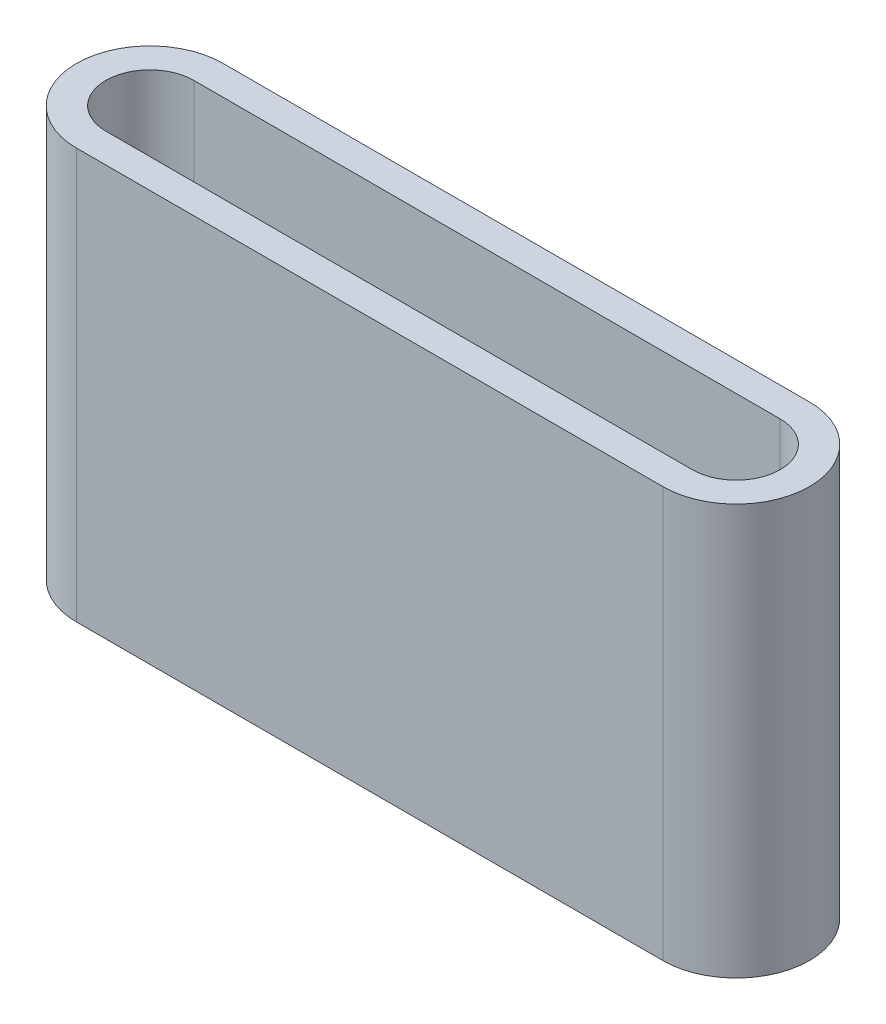
ISO-10303-21;
HEADER;
FILE_DESCRIPTION(('STEP AP214'),'2;1');
FILE_NAME('part.step','',(''),(''),'','','');
FILE_SCHEMA(('AUTOMOTIVE_DESIGN { 1 0 10303 214 1 1 1 1 }'));
ENDSEC;
DATA;
#1=APPLICATION_CONTEXT('core data for automotive mechanical design processes');
#2=APPLICATION_PROTOCOL_DEFINITION('international standard','automotive_design',2000,#1);
#3=PRODUCT_CONTEXT('',#1,'mechanical');
#4=PRODUCT('Part','Part','',(#3));
#5=PRODUCT_RELATED_PRODUCT_CATEGORY('part','',(#4));
#6=PRODUCT_DEFINITION_FORMATION('','',#4);
#7=PRODUCT_DEFINITION_CONTEXT('part definition',#1,'design');
#8=PRODUCT_DEFINITION('design','',#6,#7);
#9=PRODUCT_DEFINITION_SHAPE('','',#8);
#10=(LENGTH_UNIT() NAMED_UNIT(*) SI_UNIT(.MILLI.,.METRE.));
#11=(NAMED_UNIT(*) PLANE_ANGLE_UNIT() SI_UNIT($,.RADIAN.));
#12=(NAMED_UNIT(*) SI_UNIT($,.STERADIAN.) SOLID_ANGLE_UNIT());
#13=UNCERTAINTY_MEASURE_WITH_UNIT(LENGTH_MEASURE(1.E-05),#10,'distance_accuracy_value','');
#14=(GEOMETRIC_REPRESENTATION_CONTEXT(3) GLOBAL_UNCERTAINTY_ASSIGNED_CONTEXT((#13)) GLOBAL_UNIT_ASSIGNED_CONTEXT((#10,
#11,#12)) REPRESENTATION_CONTEXT('',''));
#15=CARTESIAN_POINT('',(0.,0.,0.));
#16=DIRECTION('',(0.,0.,1.));
#17=DIRECTION('',(1.,0.,0.));
#18=AXIS2_PLACEMENT_3D('',#15,#16,#17);
#19=CARTESIAN_POINT('',(0.,-10.,0.));
#20=DIRECTION('',(0.,1.,0.));
#21=DIRECTION('',(0.,0.,1.));
#22=AXIS2_PLACEMENT_3D('',#19,#20,#21);
#23=CYLINDRICAL_SURFACE('',#22,12.5);
#24=DIRECTION('',(0.,1.,0.));
#25=VECTOR('',#24,1.);
#26=CARTESIAN_POINT('',(0.,-10.,12.5));
#27=LINE('',#26,#25);
#28=CARTESIAN_POINT('',(0.,-10.,12.5));
#29=VERTEX_POINT('',#28);
#30=CARTESIAN_POINT('',(0.,60.,12.5));
#31=VERTEX_POINT('',#30);
#32=EDGE_CURVE('E66',#29,#31,#27,.T.);
#33=ORIENTED_EDGE('',*,*,#32,.T.);
#34=CARTESIAN_POINT('',(0.,60.,0.));
#35=DIRECTION('',(0.,1.,0.));
#36=DIRECTION('',(0.,0.,1.));
#37=AXIS2_PLACEMENT_3D('',#34,#35,#36);
#38=CIRCLE('',#37,12.5);
#39=CARTESIAN_POINT('',(0.,60.,-12.5));
#40=VERTEX_POINT('',#39);
#41=EDGE_CURVE('E145',#40,#31,#38,.T.);
#42=ORIENTED_EDGE('',*,*,#41,.F.);
#43=DIRECTION('',(0.,1.,0.));
#44=VECTOR('',#43,1.);
#45=CARTESIAN_POINT('',(0.,-10.,-12.5));
#46=LINE('',#45,#44);
#47=CARTESIAN_POINT('',(0.,-10.,-12.5));
#48=VERTEX_POINT('',#47);
#49=EDGE_CURVE('E12',#48,#40,#46,.T.);
#50=ORIENTED_EDGE('',*,*,#49,.F.);
#51=CARTESIAN_POINT('',(0.,-10.,0.));
#52=DIRECTION('',(0.,1.,0.));
#53=DIRECTION('',(0.,0.,1.));
#54=AXIS2_PLACEMENT_3D('',#51,#52,#53);
#55=CIRCLE('',#54,12.5);
#56=EDGE_CURVE('E192',#48,#29,#55,.T.);
#57=ORIENTED_EDGE('',*,*,#56,.T.);
#58=EDGE_LOOP('',(#33,#42,#50,#57));
#59=FACE_BOUND('',#58,.T.);
#60=ADVANCED_FACE('F63',(#59),#23,.T.);
#61=CARTESIAN_POINT('',(0.,-10.,-12.5));
#62=DIRECTION('',(0.,0.,-1.));
#63=DIRECTION('',(-1.,0.,0.));
#64=AXIS2_PLACEMENT_3D('',#61,#62,#63);
#65=PLANE('',#64);
#66=ORIENTED_EDGE('',*,*,#49,.T.);
#67=DIRECTION('',(-1.,0.,0.));
#68=VECTOR('',#67,1.);
#69=CARTESIAN_POINT('',(100.,60.,-12.5));
#70=LINE('',#69,#68);
#71=CARTESIAN_POINT('',(100.,60.,-12.5));
#72=VERTEX_POINT('',#71);
#73=EDGE_CURVE('E188',#72,#40,#70,.T.);
#74=ORIENTED_EDGE('',*,*,#73,.F.);
#75=DIRECTION('',(0.,1.,0.));
#76=VECTOR('',#75,1.);
#77=CARTESIAN_POINT('',(100.,-10.,-12.5));
#78=LINE('',#77,#76);
#79=CARTESIAN_POINT('',(100.,-10.,-12.5));
#80=VERTEX_POINT('',#79);
#81=EDGE_CURVE('E72',#80,#72,#78,.T.);
#82=ORIENTED_EDGE('',*,*,#81,.F.);
#83=DIRECTION('',(-1.,0.,0.));
#84=VECTOR('',#83,1.);
#85=CARTESIAN_POINT('',(0.,-10.,-12.5));
#86=LINE('',#85,#84);
#87=EDGE_CURVE('E204',#80,#48,#86,.T.);
#88=ORIENTED_EDGE('',*,*,#87,.T.);
#89=EDGE_LOOP('',(#66,#74,#82,#88));
#90=FACE_BOUND('',#89,.T.);
#91=ADVANCED_FACE('F223',(#90),#65,.T.);
#92=CARTESIAN_POINT('',(100.,-10.,0.));
#93=DIRECTION('',(0.,1.,0.));
#94=DIRECTION('',(0.,0.,1.));
#95=AXIS2_PLACEMENT_3D('',#92,#93,#94);
#96=CYLINDRICAL_SURFACE('',#95,12.5);
#97=ORIENTED_EDGE('',*,*,#81,.T.);
#98=CARTESIAN_POINT('',(100.,60.,0.));
#99=DIRECTION('',(0.,1.,0.));
#100=DIRECTION('',(0.,0.,1.));
#101=AXIS2_PLACEMENT_3D('',#98,#99,#100);
#102=CIRCLE('',#101,12.5);
#103=CARTESIAN_POINT('',(100.,60.,12.5));
#104=VERTEX_POINT('',#103);
#105=EDGE_CURVE('E184',#104,#72,#102,.T.);
#106=ORIENTED_EDGE('',*,*,#105,.F.);
#107=DIRECTION('',(0.,1.,0.));
#108=VECTOR('',#107,1.);
#109=CARTESIAN_POINT('',(100.,-10.,12.5));
#110=LINE('',#109,#108);
#111=CARTESIAN_POINT('',(100.,-10.,12.5));
#112=VERTEX_POINT('',#111);
#113=EDGE_CURVE('E209',#112,#104,#110,.T.);
#114=ORIENTED_EDGE('',*,*,#113,.F.);
#115=CARTESIAN_POINT('',(100.,-10.,0.));
#116=DIRECTION('',(0.,1.,0.));
#117=DIRECTION('',(0.,0.,1.));
#118=AXIS2_PLACEMENT_3D('',#115,#116,#117);
#119=CIRCLE('',#118,12.5);
#120=EDGE_CURVE('E200',#112,#80,#119,.T.);
#121=ORIENTED_EDGE('',*,*,#120,.T.);
#122=EDGE_LOOP('',(#97,#106,#114,#121));
#123=FACE_BOUND('',#122,.T.);
#124=ADVANCED_FACE('F229',(#123),#96,.T.);
#125=CARTESIAN_POINT('',(0.,-10.,12.5));
#126=DIRECTION('',(0.,0.,1.));
#127=DIRECTION('',(1.,0.,0.));
#128=AXIS2_PLACEMENT_3D('',#125,#126,#127);
#129=PLANE('',#128);
#130=ORIENTED_EDGE('',*,*,#113,.T.);
#131=DIRECTION('',(1.,0.,0.));
#132=VECTOR('',#131,1.);
#133=CARTESIAN_POINT('',(0.,60.,12.5));
#134=LINE('',#133,#132);
#135=EDGE_CURVE('E180',#31,#104,#134,.T.);
#136=ORIENTED_EDGE('',*,*,#135,.F.);
#137=ORIENTED_EDGE('',*,*,#32,.F.);
#138=DIRECTION('',(1.,0.,0.));
#139=VECTOR('',#138,1.);
#140=CARTESIAN_POINT('',(0.,-10.,12.5));
#141=LINE('',#140,#139);
#142=EDGE_CURVE('E196',#29,#112,#141,.T.);
#143=ORIENTED_EDGE('',*,*,#142,.T.);
#144=EDGE_LOOP('',(#130,#136,#137,#143));
#145=FACE_BOUND('',#144,.T.);
#146=ADVANCED_FACE('F218',(#145),#129,.T.);
#147=CARTESIAN_POINT('',(0.,-10.,0.));
#148=DIRECTION('',(0.,1.,0.));
#149=DIRECTION('',(0.,0.,1.));
#150=AXIS2_PLACEMENT_3D('',#147,#148,#149);
#151=PLANE('',#150);
#152=ORIENTED_EDGE('',*,*,#56,.F.);
#153=ORIENTED_EDGE('',*,*,#87,.F.);
#154=ORIENTED_EDGE('',*,*,#120,.F.);
#155=ORIENTED_EDGE('',*,*,#142,.F.);
#156=EDGE_LOOP('',(#152,#153,#154,#155));
#157=FACE_BOUND('',#156,.T.);
#158=ADVANCED_FACE('F226',(#157),#151,.F.);
#159=CARTESIAN_POINT('',(0.,60.,0.));
#160=DIRECTION('',(0.,1.,0.));
#161=DIRECTION('',(0.,0.,1.));
#162=AXIS2_PLACEMENT_3D('',#159,#160,#161);
#163=PLANE('',#162);
#164=ORIENTED_EDGE('',*,*,#41,.T.);
#165=ORIENTED_EDGE('',*,*,#135,.T.);
#166=ORIENTED_EDGE('',*,*,#105,.T.);
#167=ORIENTED_EDGE('',*,*,#73,.T.);
#168=EDGE_LOOP('',(#164,#165,#166,#167));
#169=FACE_BOUND('',#168,.T.);
#170=DIRECTION('',(1.,0.,0.));
#171=VECTOR('',#170,1.);
#172=CARTESIAN_POINT('',(0.,60.,7.5));
#173=LINE('',#172,#171);
#174=CARTESIAN_POINT('',(0.,60.,7.5));
#175=VERTEX_POINT('',#174);
#176=CARTESIAN_POINT('',(100.,60.,7.5));
#177=VERTEX_POINT('',#176);
#178=EDGE_CURVE('E138',#175,#177,#173,.T.);
#179=ORIENTED_EDGE('',*,*,#178,.F.);
#180=CARTESIAN_POINT('',(0.,60.,0.));
#181=DIRECTION('',(0.,1.,0.));
#182=DIRECTION('',(1.,0.,0.));
#183=AXIS2_PLACEMENT_3D('',#180,#181,#182);
#184=CIRCLE('',#183,7.5);
#185=CARTESIAN_POINT('',(0.,60.,-7.5));
#186=VERTEX_POINT('',#185);
#187=EDGE_CURVE('E128',#186,#175,#184,.T.);
#188=ORIENTED_EDGE('',*,*,#187,.F.);
#189=DIRECTION('',(-1.,0.,0.));
#190=VECTOR('',#189,1.);
#191=CARTESIAN_POINT('',(100.,60.,-7.5));
#192=LINE('',#191,#190);
#193=CARTESIAN_POINT('',(100.,60.,-7.5));
#194=VERTEX_POINT('',#193);
#195=EDGE_CURVE('E155',#194,#186,#192,.T.);
#196=ORIENTED_EDGE('',*,*,#195,.F.);
#197=CARTESIAN_POINT('',(100.,60.,0.));
#198=DIRECTION('',(0.,1.,0.));
#199=DIRECTION('',(1.,0.,0.));
#200=AXIS2_PLACEMENT_3D('',#197,#198,#199);
#201=CIRCLE('',#200,7.5);
#202=EDGE_CURVE('E151',#177,#194,#201,.T.);
#203=ORIENTED_EDGE('',*,*,#202,.F.);
#204=EDGE_LOOP('',(#179,#188,#196,#203));
#205=FACE_BOUND('',#204,.T.);
#206=ADVANCED_FACE('F149',(#169,#205),#163,.T.);
#207=CARTESIAN_POINT('',(0.,60.,0.));
#208=DIRECTION('',(0.,-1.,0.));
#209=DIRECTION('',(0.,0.,-1.));
#210=AXIS2_PLACEMENT_3D('',#207,#208,#209);
#211=CYLINDRICAL_SURFACE('',#210,7.5);
#212=CARTESIAN_POINT('',(0.,20.,0.));
#213=DIRECTION('',(0.,1.,0.));
#214=DIRECTION('',(1.,0.,0.));
#215=AXIS2_PLACEMENT_3D('',#212,#213,#214);
#216=CIRCLE('',#215,7.5);
#217=CARTESIAN_POINT('',(0.,20.,-7.5));
#218=VERTEX_POINT('',#217);
#219=CARTESIAN_POINT('',(0.,20.,7.5));
#220=VERTEX_POINT('',#219);
#221=EDGE_CURVE('E80',#218,#220,#216,.T.);
#222=ORIENTED_EDGE('',*,*,#221,.F.);
#223=DIRECTION('',(0.,-1.,0.));
#224=VECTOR('',#223,1.);
#225=CARTESIAN_POINT('',(0.,60.,-7.5));
#226=LINE('',#225,#224);
#227=EDGE_CURVE('E133',#186,#218,#226,.T.);
#228=ORIENTED_EDGE('',*,*,#227,.F.);
#229=ORIENTED_EDGE('',*,*,#187,.T.);
#230=DIRECTION('',(0.,-1.,0.));
#231=VECTOR('',#230,1.);
#232=CARTESIAN_POINT('',(0.,60.,7.5));
#233=LINE('',#232,#231);
#234=EDGE_CURVE('E131',#175,#220,#233,.T.);
#235=ORIENTED_EDGE('',*,*,#234,.T.);
#236=EDGE_LOOP('',(#222,#228,#229,#235));
#237=FACE_BOUND('',#236,.T.);
#238=ADVANCED_FACE('F130',(#237),#211,.F.);
#239=CARTESIAN_POINT('',(0.,60.,7.5));
#240=DIRECTION('',(0.,0.,-1.));
#241=DIRECTION('',(-1.,0.,0.));
#242=AXIS2_PLACEMENT_3D('',#239,#240,#241);
#243=PLANE('',#242);
#244=DIRECTION('',(1.,0.,0.));
#245=VECTOR('',#244,1.);
#246=CARTESIAN_POINT('',(0.,20.,7.5));
#247=LINE('',#246,#245);
#248=CARTESIAN_POINT('',(100.,20.,7.5));
#249=VERTEX_POINT('',#248);
#250=EDGE_CURVE('E84',#220,#249,#247,.T.);
#251=ORIENTED_EDGE('',*,*,#250,.F.);
#252=ORIENTED_EDGE('',*,*,#234,.F.);
#253=ORIENTED_EDGE('',*,*,#178,.T.);
#254=DIRECTION('',(0.,-1.,0.));
#255=VECTOR('',#254,1.);
#256=CARTESIAN_POINT('',(100.,60.,7.5));
#257=LINE('',#256,#255);
#258=EDGE_CURVE('E146',#177,#249,#257,.T.);
#259=ORIENTED_EDGE('',*,*,#258,.T.);
#260=EDGE_LOOP('',(#251,#252,#253,#259));
#261=FACE_BOUND('',#260,.T.);
#262=ADVANCED_FACE('F142',(#261),#243,.T.);
#263=CARTESIAN_POINT('',(100.,60.,0.));
#264=DIRECTION('',(0.,-1.,0.));
#265=DIRECTION('',(0.,0.,-1.));
#266=AXIS2_PLACEMENT_3D('',#263,#264,#265);
#267=CYLINDRICAL_SURFACE('',#266,7.5);
#268=CARTESIAN_POINT('',(100.,20.,0.));
#269=DIRECTION('',(0.,1.,0.));
#270=DIRECTION('',(1.,0.,0.));
#271=AXIS2_PLACEMENT_3D('',#268,#269,#270);
#272=CIRCLE('',#271,7.5);
#273=CARTESIAN_POINT('',(100.,20.,-7.5));
#274=VERTEX_POINT('',#273);
#275=EDGE_CURVE('E164',#249,#274,#272,.T.);
#276=ORIENTED_EDGE('',*,*,#275,.F.);
#277=ORIENTED_EDGE('',*,*,#258,.F.);
#278=ORIENTED_EDGE('',*,*,#202,.T.);
#279=DIRECTION('',(0.,-1.,0.));
#280=VECTOR('',#279,1.);
#281=CARTESIAN_POINT('',(100.,60.,-7.5));
#282=LINE('',#281,#280);
#283=EDGE_CURVE('E171',#194,#274,#282,.T.);
#284=ORIENTED_EDGE('',*,*,#283,.T.);
#285=EDGE_LOOP('',(#276,#277,#278,#284));
#286=FACE_BOUND('',#285,.T.);
#287=ADVANCED_FACE('F284',(#286),#267,.F.);
#288=CARTESIAN_POINT('',(100.,60.,-7.5));
#289=DIRECTION('',(0.,0.,1.));
#290=DIRECTION('',(1.,0.,0.));
#291=AXIS2_PLACEMENT_3D('',#288,#289,#290);
#292=PLANE('',#291);
#293=DIRECTION('',(-1.,0.,0.));
#294=VECTOR('',#293,1.);
#295=CARTESIAN_POINT('',(100.,20.,-7.5));
#296=LINE('',#295,#294);
#297=EDGE_CURVE('E139',#274,#218,#296,.T.);
#298=ORIENTED_EDGE('',*,*,#297,.F.);
#299=ORIENTED_EDGE('',*,*,#283,.F.);
#300=ORIENTED_EDGE('',*,*,#195,.T.);
#301=ORIENTED_EDGE('',*,*,#227,.T.);
#302=EDGE_LOOP('',(#298,#299,#300,#301));
#303=FACE_BOUND('',#302,.T.);
#304=ADVANCED_FACE('F293',(#303),#292,.T.);
#305=CARTESIAN_POINT('',(0.,20.,0.));
#306=DIRECTION('',(0.,1.,0.));
#307=DIRECTION('',(0.,0.,1.));
#308=AXIS2_PLACEMENT_3D('',#305,#306,#307);
#309=PLANE('',#308);
#310=ORIENTED_EDGE('',*,*,#221,.T.);
#311=ORIENTED_EDGE('',*,*,#250,.T.);
#312=ORIENTED_EDGE('',*,*,#275,.T.);
#313=ORIENTED_EDGE('',*,*,#297,.T.);
#314=EDGE_LOOP('',(#310,#311,#312,#313));
#315=FACE_BOUND('',#314,.T.);
#316=ADVANCED_FACE('F303',(#315),#309,.T.);
#317=CLOSED_SHELL('',(#60,#91,#124,#146,#158,#206,#238,#262,#287,#304,#316));
#318=MANIFOLD_SOLID_BREP('B2',#317);
#319=ADVANCED_BREP_SHAPE_REPRESENTATION('',(#18,#318),#14);
#320=SHAPE_DEFINITION_REPRESENTATION(#9,#319);
ENDSEC;
END-ISO-10303-21;
